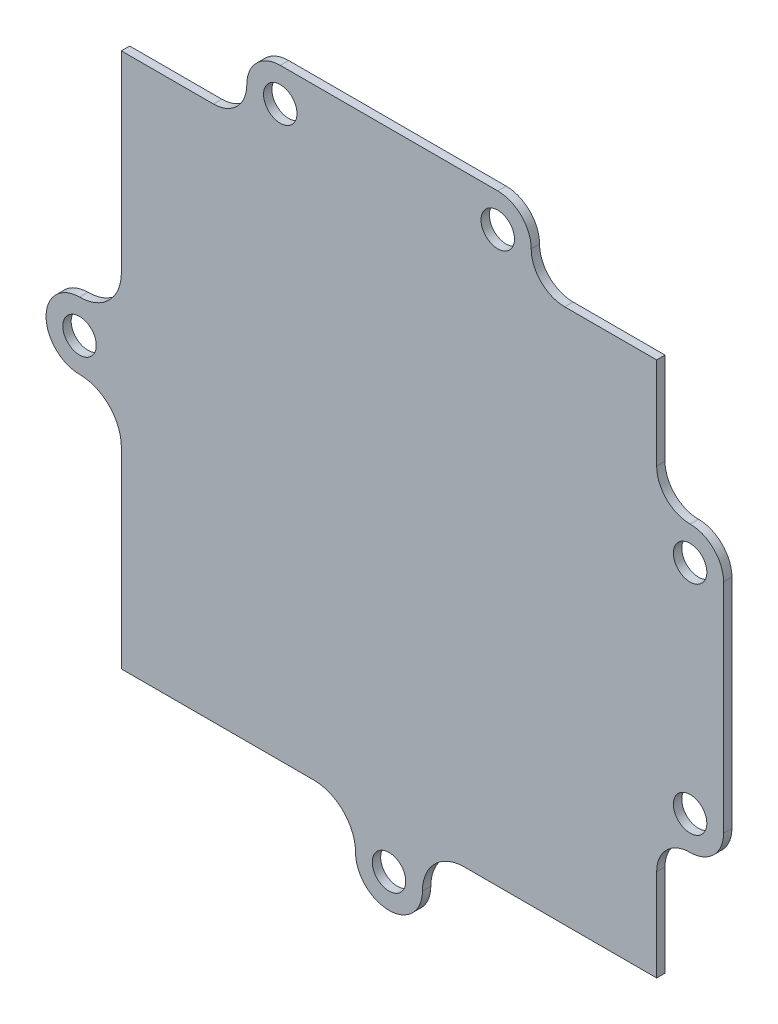
ISO-10303-21;
HEADER;
FILE_DESCRIPTION(('STEP AP214'),'2;1');
FILE_NAME('part.step','',(''),(''),'','','');
FILE_SCHEMA(('AUTOMOTIVE_DESIGN { 1 0 10303 214 1 1 1 1 }'));
ENDSEC;
DATA;
#1=APPLICATION_CONTEXT('core data for automotive mechanical design processes');
#2=APPLICATION_PROTOCOL_DEFINITION('international standard','automotive_design',2000,#1);
#3=PRODUCT_CONTEXT('',#1,'mechanical');
#4=PRODUCT('Part','Part','',(#3));
#5=PRODUCT_RELATED_PRODUCT_CATEGORY('part','',(#4));
#6=PRODUCT_DEFINITION_FORMATION('','',#4);
#7=PRODUCT_DEFINITION_CONTEXT('part definition',#1,'design');
#8=PRODUCT_DEFINITION('design','',#6,#7);
#9=PRODUCT_DEFINITION_SHAPE('','',#8);
#10=(LENGTH_UNIT() NAMED_UNIT(*) SI_UNIT(.MILLI.,.METRE.));
#11=(NAMED_UNIT(*) PLANE_ANGLE_UNIT() SI_UNIT($,.RADIAN.));
#12=(NAMED_UNIT(*) SI_UNIT($,.STERADIAN.) SOLID_ANGLE_UNIT());
#13=UNCERTAINTY_MEASURE_WITH_UNIT(LENGTH_MEASURE(1.E-05),#10,'distance_accuracy_value','');
#14=(GEOMETRIC_REPRESENTATION_CONTEXT(3) GLOBAL_UNCERTAINTY_ASSIGNED_CONTEXT((#13)) GLOBAL_UNIT_ASSIGNED_CONTEXT((#10,
#11,#12)) REPRESENTATION_CONTEXT('',''));
#15=CARTESIAN_POINT('',(0.,0.,0.));
#16=DIRECTION('',(0.,0.,1.));
#17=DIRECTION('',(1.,0.,0.));
#18=AXIS2_PLACEMENT_3D('',#15,#16,#17);
#19=CARTESIAN_POINT('',(36.0000000000001,-21.0000000000002,1.));
#20=DIRECTION('',(0.,0.,1.));
#21=DIRECTION('',(1.,0.,0.));
#22=AXIS2_PLACEMENT_3D('',#19,#20,#21);
#23=PLANE('',#22);
#24=CARTESIAN_POINT('',(36.0000000000001,13.0000000000001,1.));
#25=DIRECTION('',(0.,0.,1.));
#26=DIRECTION('',(1.,0.,0.));
#27=AXIS2_PLACEMENT_3D('',#24,#25,#26);
#28=CIRCLE('',#27,2.);
#29=CARTESIAN_POINT('',(38.0000000000001,13.0000000000001,1.));
#30=VERTEX_POINT('',#29);
#31=EDGE_CURVE('E455',#30,#30,#28,.T.);
#32=ORIENTED_EDGE('',*,*,#31,.F.);
#33=EDGE_LOOP('',(#32));
#34=FACE_BOUND('',#33,.T.);
#35=CARTESIAN_POINT('',(0.,-37.,1.));
#36=DIRECTION('',(0.,0.,1.));
#37=DIRECTION('',(1.,0.,0.));
#38=AXIS2_PLACEMENT_3D('',#35,#36,#37);
#39=CIRCLE('',#38,2.);
#40=CARTESIAN_POINT('',(2.00000000000001,-37.,1.));
#41=VERTEX_POINT('',#40);
#42=EDGE_CURVE('E467',#41,#41,#39,.T.);
#43=ORIENTED_EDGE('',*,*,#42,.F.);
#44=EDGE_LOOP('',(#43));
#45=FACE_BOUND('',#44,.T.);
#46=CARTESIAN_POINT('',(-37.,0.,1.));
#47=DIRECTION('',(0.,0.,1.));
#48=DIRECTION('',(1.,0.,0.));
#49=AXIS2_PLACEMENT_3D('',#46,#47,#48);
#50=CIRCLE('',#49,2.);
#51=CARTESIAN_POINT('',(-35.,0.,1.));
#52=VERTEX_POINT('',#51);
#53=EDGE_CURVE('E230',#52,#52,#50,.T.);
#54=ORIENTED_EDGE('',*,*,#53,.F.);
#55=EDGE_LOOP('',(#54));
#56=FACE_BOUND('',#55,.T.);
#57=CARTESIAN_POINT('',(36.0000000000001,-21.0000000000002,1.));
#58=DIRECTION('',(0.,0.,-1.));
#59=DIRECTION('',(1.,0.,0.));
#60=AXIS2_PLACEMENT_3D('',#57,#58,#59);
#61=CIRCLE('',#60,4.00000000000012);
#62=CARTESIAN_POINT('',(32.,-21.0000000000002,1.));
#63=VERTEX_POINT('',#62);
#64=CARTESIAN_POINT('',(36.0000000000001,-17.0000000000001,1.));
#65=VERTEX_POINT('',#64);
#66=EDGE_CURVE('E273',#63,#65,#61,.T.);
#67=ORIENTED_EDGE('',*,*,#66,.T.);
#68=CARTESIAN_POINT('',(36.0000000000001,-13.0000000000001,1.));
#69=DIRECTION('',(0.,0.,1.));
#70=DIRECTION('',(1.,0.,0.));
#71=AXIS2_PLACEMENT_3D('',#68,#69,#70);
#72=CIRCLE('',#71,3.99999999999997);
#73=CARTESIAN_POINT('',(40.0000000000001,-13.0000000000001,1.));
#74=VERTEX_POINT('',#73);
#75=EDGE_CURVE('E141',#65,#74,#72,.T.);
#76=ORIENTED_EDGE('',*,*,#75,.T.);
#77=DIRECTION('',(0.,1.,0.));
#78=VECTOR('',#77,1.);
#79=CARTESIAN_POINT('',(40.0000000000001,-13.0000000000001,1.));
#80=LINE('',#79,#78);
#81=CARTESIAN_POINT('',(40.0000000000001,13.0000000000001,1.));
#82=VERTEX_POINT('',#81);
#83=EDGE_CURVE('E336',#74,#82,#80,.T.);
#84=ORIENTED_EDGE('',*,*,#83,.T.);
#85=CARTESIAN_POINT('',(36.0000000000001,13.0000000000001,1.));
#86=DIRECTION('',(0.,0.,1.));
#87=DIRECTION('',(1.,0.,0.));
#88=AXIS2_PLACEMENT_3D('',#85,#86,#87);
#89=CIRCLE('',#88,3.99999999999998);
#90=CARTESIAN_POINT('',(36.0000000000001,17.0000000000001,1.));
#91=VERTEX_POINT('',#90);
#92=EDGE_CURVE('E355',#82,#91,#89,.T.);
#93=ORIENTED_EDGE('',*,*,#92,.T.);
#94=CARTESIAN_POINT('',(36.0000000000001,21.0000000000003,1.));
#95=DIRECTION('',(0.,0.,-1.));
#96=DIRECTION('',(1.,0.,0.));
#97=AXIS2_PLACEMENT_3D('',#94,#95,#96);
#98=CIRCLE('',#97,4.00000000000011);
#99=CARTESIAN_POINT('',(32.,21.0000000000003,1.));
#100=VERTEX_POINT('',#99);
#101=EDGE_CURVE('E352',#91,#100,#98,.T.);
#102=ORIENTED_EDGE('',*,*,#101,.T.);
#103=DIRECTION('',(0.,1.,0.));
#104=VECTOR('',#103,1.);
#105=CARTESIAN_POINT('',(32.,21.0000000000003,1.));
#106=LINE('',#105,#104);
#107=CARTESIAN_POINT('',(32.,32.,1.));
#108=VERTEX_POINT('',#107);
#109=EDGE_CURVE('E354',#100,#108,#106,.T.);
#110=ORIENTED_EDGE('',*,*,#109,.T.);
#111=DIRECTION('',(-1.,0.,0.));
#112=VECTOR('',#111,1.);
#113=CARTESIAN_POINT('',(32.,32.,1.));
#114=LINE('',#113,#112);
#115=CARTESIAN_POINT('',(21.0000000000002,32.,1.));
#116=VERTEX_POINT('',#115);
#117=EDGE_CURVE('E357',#108,#116,#114,.T.);
#118=ORIENTED_EDGE('',*,*,#117,.T.);
#119=CARTESIAN_POINT('',(21.0000000000002,36.0000000000001,1.));
#120=DIRECTION('',(0.,0.,-1.));
#121=DIRECTION('',(1.,0.,0.));
#122=AXIS2_PLACEMENT_3D('',#119,#120,#121);
#123=CIRCLE('',#122,4.00000000000011);
#124=CARTESIAN_POINT('',(17.0000000000001,36.0000000000001,1.));
#125=VERTEX_POINT('',#124);
#126=EDGE_CURVE('E363',#116,#125,#123,.T.);
#127=ORIENTED_EDGE('',*,*,#126,.T.);
#128=CARTESIAN_POINT('',(13.0000000000001,36.0000000000001,1.));
#129=DIRECTION('',(0.,0.,1.));
#130=DIRECTION('',(1.,0.,0.));
#131=AXIS2_PLACEMENT_3D('',#128,#129,#130);
#132=CIRCLE('',#131,4.);
#133=CARTESIAN_POINT('',(13.0000000000001,40.0000000000001,1.));
#134=VERTEX_POINT('',#133);
#135=EDGE_CURVE('E365',#125,#134,#132,.T.);
#136=ORIENTED_EDGE('',*,*,#135,.T.);
#137=DIRECTION('',(-1.,0.,0.));
#138=VECTOR('',#137,1.);
#139=CARTESIAN_POINT('',(13.0000000000001,40.0000000000001,1.));
#140=LINE('',#139,#138);
#141=CARTESIAN_POINT('',(-13.0000000000001,40.0000000000001,1.));
#142=VERTEX_POINT('',#141);
#143=EDGE_CURVE('E367',#134,#142,#140,.T.);
#144=ORIENTED_EDGE('',*,*,#143,.T.);
#145=CARTESIAN_POINT('',(-13.0000000000001,36.0000000000001,1.));
#146=DIRECTION('',(0.,0.,1.));
#147=DIRECTION('',(1.,0.,0.));
#148=AXIS2_PLACEMENT_3D('',#145,#146,#147);
#149=CIRCLE('',#148,3.99999999999997);
#150=CARTESIAN_POINT('',(-17.0000000000001,36.0000000000001,1.));
#151=VERTEX_POINT('',#150);
#152=EDGE_CURVE('E369',#142,#151,#149,.T.);
#153=ORIENTED_EDGE('',*,*,#152,.T.);
#154=CARTESIAN_POINT('',(-21.0000000000003,36.0000000000001,1.));
#155=DIRECTION('',(0.,0.,-1.));
#156=DIRECTION('',(1.,0.,0.));
#157=AXIS2_PLACEMENT_3D('',#154,#155,#156);
#158=CIRCLE('',#157,4.00000000000012);
#159=CARTESIAN_POINT('',(-21.0000000000003,32.,1.));
#160=VERTEX_POINT('',#159);
#161=EDGE_CURVE('E371',#151,#160,#158,.T.);
#162=ORIENTED_EDGE('',*,*,#161,.T.);
#163=DIRECTION('',(-1.,0.,0.));
#164=VECTOR('',#163,1.);
#165=CARTESIAN_POINT('',(-21.0000000000003,32.,1.));
#166=LINE('',#165,#164);
#167=CARTESIAN_POINT('',(-32.,32.,1.));
#168=VERTEX_POINT('',#167);
#169=EDGE_CURVE('E373',#160,#168,#166,.T.);
#170=ORIENTED_EDGE('',*,*,#169,.T.);
#171=DIRECTION('',(0.,-1.,0.));
#172=VECTOR('',#171,1.);
#173=CARTESIAN_POINT('',(-32.,32.,1.));
#174=LINE('',#173,#172);
#175=CARTESIAN_POINT('',(-32.,9.00000000000001,1.));
#176=VERTEX_POINT('',#175);
#177=EDGE_CURVE('E375',#168,#176,#174,.T.);
#178=ORIENTED_EDGE('',*,*,#177,.T.);
#179=CARTESIAN_POINT('',(-37.,9.00000000000001,1.));
#180=DIRECTION('',(0.,0.,-1.));
#181=DIRECTION('',(1.,0.,0.));
#182=AXIS2_PLACEMENT_3D('',#179,#180,#181);
#183=CIRCLE('',#182,5.);
#184=CARTESIAN_POINT('',(-37.,4.,1.));
#185=VERTEX_POINT('',#184);
#186=EDGE_CURVE('E377',#176,#185,#183,.T.);
#187=ORIENTED_EDGE('',*,*,#186,.T.);
#188=CARTESIAN_POINT('',(-37.,0.,1.));
#189=DIRECTION('',(0.,0.,1.));
#190=DIRECTION('',(1.,0.,0.));
#191=AXIS2_PLACEMENT_3D('',#188,#189,#190);
#192=CIRCLE('',#191,4.);
#193=CARTESIAN_POINT('',(-37.,-4.,1.));
#194=VERTEX_POINT('',#193);
#195=EDGE_CURVE('E379',#185,#194,#192,.T.);
#196=ORIENTED_EDGE('',*,*,#195,.T.);
#197=CARTESIAN_POINT('',(-37.,-9.00000000000001,1.));
#198=DIRECTION('',(0.,0.,-1.));
#199=DIRECTION('',(1.,0.,0.));
#200=AXIS2_PLACEMENT_3D('',#197,#198,#199);
#201=CIRCLE('',#200,5.);
#202=CARTESIAN_POINT('',(-32.,-9.00000000000001,1.));
#203=VERTEX_POINT('',#202);
#204=EDGE_CURVE('E381',#194,#203,#201,.T.);
#205=ORIENTED_EDGE('',*,*,#204,.T.);
#206=DIRECTION('',(0.,-1.,0.));
#207=VECTOR('',#206,1.);
#208=CARTESIAN_POINT('',(-32.,-9.00000000000001,1.));
#209=LINE('',#208,#207);
#210=CARTESIAN_POINT('',(-32.,-32.,1.));
#211=VERTEX_POINT('',#210);
#212=EDGE_CURVE('E383',#203,#211,#209,.T.);
#213=ORIENTED_EDGE('',*,*,#212,.T.);
#214=DIRECTION('',(1.,0.,0.));
#215=VECTOR('',#214,1.);
#216=CARTESIAN_POINT('',(-32.,-32.,1.));
#217=LINE('',#216,#215);
#218=CARTESIAN_POINT('',(-9.,-32.,1.));
#219=VERTEX_POINT('',#218);
#220=EDGE_CURVE('E385',#211,#219,#217,.T.);
#221=ORIENTED_EDGE('',*,*,#220,.T.);
#222=CARTESIAN_POINT('',(-9.,-37.,1.));
#223=DIRECTION('',(0.,0.,-1.));
#224=DIRECTION('',(1.,0.,0.));
#225=AXIS2_PLACEMENT_3D('',#222,#223,#224);
#226=CIRCLE('',#225,5.);
#227=CARTESIAN_POINT('',(-3.99999999999999,-37.,1.));
#228=VERTEX_POINT('',#227);
#229=EDGE_CURVE('E387',#219,#228,#226,.T.);
#230=ORIENTED_EDGE('',*,*,#229,.T.);
#231=CARTESIAN_POINT('',(0.,-37.,1.));
#232=DIRECTION('',(0.,0.,1.));
#233=DIRECTION('',(1.,0.,0.));
#234=AXIS2_PLACEMENT_3D('',#231,#232,#233);
#235=CIRCLE('',#234,4.);
#236=CARTESIAN_POINT('',(4.00000000000001,-37.,1.));
#237=VERTEX_POINT('',#236);
#238=EDGE_CURVE('E208',#228,#237,#235,.T.);
#239=ORIENTED_EDGE('',*,*,#238,.T.);
#240=CARTESIAN_POINT('',(9.00000000000001,-37.,1.));
#241=DIRECTION('',(0.,0.,-1.));
#242=DIRECTION('',(1.,0.,0.));
#243=AXIS2_PLACEMENT_3D('',#240,#241,#242);
#244=CIRCLE('',#243,5.);
#245=CARTESIAN_POINT('',(9.00000000000001,-32.,1.));
#246=VERTEX_POINT('',#245);
#247=EDGE_CURVE('E202',#237,#246,#244,.T.);
#248=ORIENTED_EDGE('',*,*,#247,.T.);
#249=DIRECTION('',(1.,0.,0.));
#250=VECTOR('',#249,1.);
#251=CARTESIAN_POINT('',(9.00000000000001,-32.,1.));
#252=LINE('',#251,#250);
#253=CARTESIAN_POINT('',(32.,-32.,1.));
#254=VERTEX_POINT('',#253);
#255=EDGE_CURVE('E206',#246,#254,#252,.T.);
#256=ORIENTED_EDGE('',*,*,#255,.T.);
#257=DIRECTION('',(0.,1.,0.));
#258=VECTOR('',#257,1.);
#259=CARTESIAN_POINT('',(32.,-32.,1.));
#260=LINE('',#259,#258);
#261=EDGE_CURVE('E50',#254,#63,#260,.T.);
#262=ORIENTED_EDGE('',*,*,#261,.T.);
#263=EDGE_LOOP('',(#67,#76,#84,#93,#102,#110,#118,#127,#136,#144,#153,#162,#170,#178,#187,#196,
#205,#213,#221,#230,#239,#248,#256,#262));
#264=FACE_BOUND('',#263,.T.);
#265=CARTESIAN_POINT('',(-13.0000000000001,36.0000000000001,1.));
#266=DIRECTION('',(0.,0.,1.));
#267=DIRECTION('',(1.,0.,0.));
#268=AXIS2_PLACEMENT_3D('',#265,#266,#267);
#269=CIRCLE('',#268,2.);
#270=CARTESIAN_POINT('',(-11.0000000000001,36.0000000000001,1.));
#271=VERTEX_POINT('',#270);
#272=EDGE_CURVE('E473',#271,#271,#269,.T.);
#273=ORIENTED_EDGE('',*,*,#272,.F.);
#274=EDGE_LOOP('',(#273));
#275=FACE_BOUND('',#274,.T.);
#276=CARTESIAN_POINT('',(36.0000000000001,-13.0000000000001,1.));
#277=DIRECTION('',(0.,0.,1.));
#278=DIRECTION('',(1.,0.,0.));
#279=AXIS2_PLACEMENT_3D('',#276,#277,#278);
#280=CIRCLE('',#279,2.);
#281=CARTESIAN_POINT('',(38.0000000000001,-13.0000000000001,1.));
#282=VERTEX_POINT('',#281);
#283=EDGE_CURVE('E461',#282,#282,#280,.T.);
#284=ORIENTED_EDGE('',*,*,#283,.F.);
#285=EDGE_LOOP('',(#284));
#286=FACE_BOUND('',#285,.T.);
#287=CARTESIAN_POINT('',(13.0000000000001,36.0000000000001,1.));
#288=DIRECTION('',(0.,0.,1.));
#289=DIRECTION('',(1.,0.,0.));
#290=AXIS2_PLACEMENT_3D('',#287,#288,#289);
#291=CIRCLE('',#290,2.);
#292=CARTESIAN_POINT('',(15.0000000000001,36.0000000000001,1.));
#293=VERTEX_POINT('',#292);
#294=EDGE_CURVE('E446',#293,#293,#291,.T.);
#295=ORIENTED_EDGE('',*,*,#294,.F.);
#296=EDGE_LOOP('',(#295));
#297=FACE_BOUND('',#296,.T.);
#298=ADVANCED_FACE('F33',(#34,#45,#56,#264,#275,#286,#297),#23,.T.);
#299=CARTESIAN_POINT('',(36.0000000000001,-21.0000000000002,0.));
#300=DIRECTION('',(0.,0.,1.));
#301=DIRECTION('',(1.,0.,0.));
#302=AXIS2_PLACEMENT_3D('',#299,#300,#301);
#303=PLANE('',#302);
#304=CARTESIAN_POINT('',(36.0000000000001,-21.0000000000002,0.));
#305=DIRECTION('',(0.,0.,-1.));
#306=DIRECTION('',(1.,0.,0.));
#307=AXIS2_PLACEMENT_3D('',#304,#305,#306);
#308=CIRCLE('',#307,4.00000000000012);
#309=CARTESIAN_POINT('',(32.,-21.0000000000002,0.));
#310=VERTEX_POINT('',#309);
#311=CARTESIAN_POINT('',(36.0000000000001,-17.0000000000001,0.));
#312=VERTEX_POINT('',#311);
#313=EDGE_CURVE('E226',#310,#312,#308,.T.);
#314=ORIENTED_EDGE('',*,*,#313,.F.);
#315=DIRECTION('',(0.,1.,0.));
#316=VECTOR('',#315,1.);
#317=CARTESIAN_POINT('',(32.,-32.,0.));
#318=LINE('',#317,#316);
#319=CARTESIAN_POINT('',(32.,-32.,0.));
#320=VERTEX_POINT('',#319);
#321=EDGE_CURVE('E133',#320,#310,#318,.T.);
#322=ORIENTED_EDGE('',*,*,#321,.F.);
#323=DIRECTION('',(1.,0.,0.));
#324=VECTOR('',#323,1.);
#325=CARTESIAN_POINT('',(9.00000000000001,-32.,0.));
#326=LINE('',#325,#324);
#327=CARTESIAN_POINT('',(9.00000000000001,-32.,0.));
#328=VERTEX_POINT('',#327);
#329=EDGE_CURVE('E127',#328,#320,#326,.T.);
#330=ORIENTED_EDGE('',*,*,#329,.F.);
#331=CARTESIAN_POINT('',(9.00000000000001,-37.,0.));
#332=DIRECTION('',(0.,0.,-1.));
#333=DIRECTION('',(1.,0.,0.));
#334=AXIS2_PLACEMENT_3D('',#331,#332,#333);
#335=CIRCLE('',#334,5.);
#336=CARTESIAN_POINT('',(4.00000000000001,-37.,0.));
#337=VERTEX_POINT('',#336);
#338=EDGE_CURVE('E216',#337,#328,#335,.T.);
#339=ORIENTED_EDGE('',*,*,#338,.F.);
#340=CARTESIAN_POINT('',(0.,-37.,0.));
#341=DIRECTION('',(0.,0.,1.));
#342=DIRECTION('',(1.,0.,0.));
#343=AXIS2_PLACEMENT_3D('',#340,#341,#342);
#344=CIRCLE('',#343,4.);
#345=CARTESIAN_POINT('',(-3.99999999999999,-37.,0.));
#346=VERTEX_POINT('',#345);
#347=EDGE_CURVE('E268',#346,#337,#344,.T.);
#348=ORIENTED_EDGE('',*,*,#347,.F.);
#349=CARTESIAN_POINT('',(-9.,-37.,0.));
#350=DIRECTION('',(0.,0.,-1.));
#351=DIRECTION('',(1.,0.,0.));
#352=AXIS2_PLACEMENT_3D('',#349,#350,#351);
#353=CIRCLE('',#352,5.);
#354=CARTESIAN_POINT('',(-9.,-32.,0.));
#355=VERTEX_POINT('',#354);
#356=EDGE_CURVE('E266',#355,#346,#353,.T.);
#357=ORIENTED_EDGE('',*,*,#356,.F.);
#358=DIRECTION('',(1.,0.,0.));
#359=VECTOR('',#358,1.);
#360=CARTESIAN_POINT('',(-32.,-32.,0.));
#361=LINE('',#360,#359);
#362=CARTESIAN_POINT('',(-32.,-32.,0.));
#363=VERTEX_POINT('',#362);
#364=EDGE_CURVE('E264',#363,#355,#361,.T.);
#365=ORIENTED_EDGE('',*,*,#364,.F.);
#366=DIRECTION('',(0.,-1.,0.));
#367=VECTOR('',#366,1.);
#368=CARTESIAN_POINT('',(-32.,-9.00000000000001,0.));
#369=LINE('',#368,#367);
#370=CARTESIAN_POINT('',(-32.,-9.00000000000001,0.));
#371=VERTEX_POINT('',#370);
#372=EDGE_CURVE('E262',#371,#363,#369,.T.);
#373=ORIENTED_EDGE('',*,*,#372,.F.);
#374=CARTESIAN_POINT('',(-37.,-9.00000000000001,0.));
#375=DIRECTION('',(0.,0.,-1.));
#376=DIRECTION('',(1.,0.,0.));
#377=AXIS2_PLACEMENT_3D('',#374,#375,#376);
#378=CIRCLE('',#377,5.);
#379=CARTESIAN_POINT('',(-37.,-4.,0.));
#380=VERTEX_POINT('',#379);
#381=EDGE_CURVE('E260',#380,#371,#378,.T.);
#382=ORIENTED_EDGE('',*,*,#381,.F.);
#383=CARTESIAN_POINT('',(-37.,0.,0.));
#384=DIRECTION('',(0.,0.,1.));
#385=DIRECTION('',(1.,0.,0.));
#386=AXIS2_PLACEMENT_3D('',#383,#384,#385);
#387=CIRCLE('',#386,4.);
#388=CARTESIAN_POINT('',(-37.,4.,0.));
#389=VERTEX_POINT('',#388);
#390=EDGE_CURVE('E258',#389,#380,#387,.T.);
#391=ORIENTED_EDGE('',*,*,#390,.F.);
#392=CARTESIAN_POINT('',(-37.,9.00000000000001,0.));
#393=DIRECTION('',(0.,0.,-1.));
#394=DIRECTION('',(1.,0.,0.));
#395=AXIS2_PLACEMENT_3D('',#392,#393,#394);
#396=CIRCLE('',#395,5.);
#397=CARTESIAN_POINT('',(-32.,9.00000000000001,0.));
#398=VERTEX_POINT('',#397);
#399=EDGE_CURVE('E256',#398,#389,#396,.T.);
#400=ORIENTED_EDGE('',*,*,#399,.F.);
#401=DIRECTION('',(0.,-1.,0.));
#402=VECTOR('',#401,1.);
#403=CARTESIAN_POINT('',(-32.,32.,0.));
#404=LINE('',#403,#402);
#405=CARTESIAN_POINT('',(-32.,32.,0.));
#406=VERTEX_POINT('',#405);
#407=EDGE_CURVE('E254',#406,#398,#404,.T.);
#408=ORIENTED_EDGE('',*,*,#407,.F.);
#409=DIRECTION('',(-1.,0.,0.));
#410=VECTOR('',#409,1.);
#411=CARTESIAN_POINT('',(-21.0000000000003,32.,0.));
#412=LINE('',#411,#410);
#413=CARTESIAN_POINT('',(-21.0000000000003,32.,0.));
#414=VERTEX_POINT('',#413);
#415=EDGE_CURVE('E252',#414,#406,#412,.T.);
#416=ORIENTED_EDGE('',*,*,#415,.F.);
#417=CARTESIAN_POINT('',(-21.0000000000003,36.0000000000001,0.));
#418=DIRECTION('',(0.,0.,-1.));
#419=DIRECTION('',(1.,0.,0.));
#420=AXIS2_PLACEMENT_3D('',#417,#418,#419);
#421=CIRCLE('',#420,4.00000000000012);
#422=CARTESIAN_POINT('',(-17.0000000000001,36.0000000000001,0.));
#423=VERTEX_POINT('',#422);
#424=EDGE_CURVE('E250',#423,#414,#421,.T.);
#425=ORIENTED_EDGE('',*,*,#424,.F.);
#426=CARTESIAN_POINT('',(-13.0000000000001,36.0000000000001,0.));
#427=DIRECTION('',(0.,0.,1.));
#428=DIRECTION('',(1.,0.,0.));
#429=AXIS2_PLACEMENT_3D('',#426,#427,#428);
#430=CIRCLE('',#429,3.99999999999997);
#431=CARTESIAN_POINT('',(-13.0000000000001,40.0000000000001,0.));
#432=VERTEX_POINT('',#431);
#433=EDGE_CURVE('E248',#432,#423,#430,.T.);
#434=ORIENTED_EDGE('',*,*,#433,.F.);
#435=DIRECTION('',(-1.,0.,0.));
#436=VECTOR('',#435,1.);
#437=CARTESIAN_POINT('',(13.0000000000001,40.0000000000001,0.));
#438=LINE('',#437,#436);
#439=CARTESIAN_POINT('',(13.0000000000001,40.0000000000001,0.));
#440=VERTEX_POINT('',#439);
#441=EDGE_CURVE('E246',#440,#432,#438,.T.);
#442=ORIENTED_EDGE('',*,*,#441,.F.);
#443=CARTESIAN_POINT('',(13.0000000000001,36.0000000000001,0.));
#444=DIRECTION('',(0.,0.,1.));
#445=DIRECTION('',(1.,0.,0.));
#446=AXIS2_PLACEMENT_3D('',#443,#444,#445);
#447=CIRCLE('',#446,4.);
#448=CARTESIAN_POINT('',(17.0000000000001,36.0000000000001,0.));
#449=VERTEX_POINT('',#448);
#450=EDGE_CURVE('E244',#449,#440,#447,.T.);
#451=ORIENTED_EDGE('',*,*,#450,.F.);
#452=CARTESIAN_POINT('',(21.0000000000002,36.0000000000001,0.));
#453=DIRECTION('',(0.,0.,-1.));
#454=DIRECTION('',(1.,0.,0.));
#455=AXIS2_PLACEMENT_3D('',#452,#453,#454);
#456=CIRCLE('',#455,4.00000000000011);
#457=CARTESIAN_POINT('',(21.0000000000002,32.,0.));
#458=VERTEX_POINT('',#457);
#459=EDGE_CURVE('E242',#458,#449,#456,.T.);
#460=ORIENTED_EDGE('',*,*,#459,.F.);
#461=DIRECTION('',(-1.,0.,0.));
#462=VECTOR('',#461,1.);
#463=CARTESIAN_POINT('',(32.,32.,0.));
#464=LINE('',#463,#462);
#465=CARTESIAN_POINT('',(32.,32.,0.));
#466=VERTEX_POINT('',#465);
#467=EDGE_CURVE('E240',#466,#458,#464,.T.);
#468=ORIENTED_EDGE('',*,*,#467,.F.);
#469=DIRECTION('',(0.,1.,0.));
#470=VECTOR('',#469,1.);
#471=CARTESIAN_POINT('',(32.,21.0000000000003,0.));
#472=LINE('',#471,#470);
#473=CARTESIAN_POINT('',(32.,21.0000000000003,0.));
#474=VERTEX_POINT('',#473);
#475=EDGE_CURVE('E238',#474,#466,#472,.T.);
#476=ORIENTED_EDGE('',*,*,#475,.F.);
#477=CARTESIAN_POINT('',(36.0000000000001,21.0000000000003,0.));
#478=DIRECTION('',(0.,0.,-1.));
#479=DIRECTION('',(1.,0.,0.));
#480=AXIS2_PLACEMENT_3D('',#477,#478,#479);
#481=CIRCLE('',#480,4.00000000000011);
#482=CARTESIAN_POINT('',(36.0000000000001,17.0000000000001,0.));
#483=VERTEX_POINT('',#482);
#484=EDGE_CURVE('E236',#483,#474,#481,.T.);
#485=ORIENTED_EDGE('',*,*,#484,.F.);
#486=CARTESIAN_POINT('',(36.0000000000001,13.0000000000001,0.));
#487=DIRECTION('',(0.,0.,1.));
#488=DIRECTION('',(1.,0.,0.));
#489=AXIS2_PLACEMENT_3D('',#486,#487,#488);
#490=CIRCLE('',#489,3.99999999999998);
#491=CARTESIAN_POINT('',(40.0000000000001,13.0000000000001,0.));
#492=VERTEX_POINT('',#491);
#493=EDGE_CURVE('E234',#492,#483,#490,.T.);
#494=ORIENTED_EDGE('',*,*,#493,.F.);
#495=DIRECTION('',(0.,1.,0.));
#496=VECTOR('',#495,1.);
#497=CARTESIAN_POINT('',(40.0000000000001,-13.0000000000001,0.));
#498=LINE('',#497,#496);
#499=CARTESIAN_POINT('',(40.0000000000001,-13.0000000000001,0.));
#500=VERTEX_POINT('',#499);
#501=EDGE_CURVE('E232',#500,#492,#498,.T.);
#502=ORIENTED_EDGE('',*,*,#501,.F.);
#503=CARTESIAN_POINT('',(36.0000000000001,-13.0000000000001,0.));
#504=DIRECTION('',(0.,0.,1.));
#505=DIRECTION('',(1.,0.,0.));
#506=AXIS2_PLACEMENT_3D('',#503,#504,#505);
#507=CIRCLE('',#506,3.99999999999997);
#508=EDGE_CURVE('E229',#312,#500,#507,.T.);
#509=ORIENTED_EDGE('',*,*,#508,.F.);
#510=EDGE_LOOP('',(#314,#322,#330,#339,#348,#357,#365,#373,#382,#391,#400,#408,#416,#425,#434,
#442,#451,#460,#468,#476,#485,#494,#502,#509));
#511=FACE_BOUND('',#510,.T.);
#512=CARTESIAN_POINT('',(-37.,0.,0.));
#513=DIRECTION('',(0.,0.,1.));
#514=DIRECTION('',(1.,0.,0.));
#515=AXIS2_PLACEMENT_3D('',#512,#513,#514);
#516=CIRCLE('',#515,2.);
#517=CARTESIAN_POINT('',(-35.,0.,0.));
#518=VERTEX_POINT('',#517);
#519=EDGE_CURVE('E476',#518,#518,#516,.T.);
#520=ORIENTED_EDGE('',*,*,#519,.T.);
#521=EDGE_LOOP('',(#520));
#522=FACE_BOUND('',#521,.T.);
#523=CARTESIAN_POINT('',(-13.0000000000001,36.0000000000001,0.));
#524=DIRECTION('',(0.,0.,1.));
#525=DIRECTION('',(1.,0.,0.));
#526=AXIS2_PLACEMENT_3D('',#523,#524,#525);
#527=CIRCLE('',#526,2.);
#528=CARTESIAN_POINT('',(-11.0000000000001,36.0000000000001,0.));
#529=VERTEX_POINT('',#528);
#530=EDGE_CURVE('E470',#529,#529,#527,.T.);
#531=ORIENTED_EDGE('',*,*,#530,.T.);
#532=EDGE_LOOP('',(#531));
#533=FACE_BOUND('',#532,.T.);
#534=CARTESIAN_POINT('',(0.,-37.,0.));
#535=DIRECTION('',(0.,0.,1.));
#536=DIRECTION('',(1.,0.,0.));
#537=AXIS2_PLACEMENT_3D('',#534,#535,#536);
#538=CIRCLE('',#537,2.);
#539=CARTESIAN_POINT('',(2.00000000000001,-37.,0.));
#540=VERTEX_POINT('',#539);
#541=EDGE_CURVE('E464',#540,#540,#538,.T.);
#542=ORIENTED_EDGE('',*,*,#541,.T.);
#543=EDGE_LOOP('',(#542));
#544=FACE_BOUND('',#543,.T.);
#545=CARTESIAN_POINT('',(36.0000000000001,-13.0000000000001,0.));
#546=DIRECTION('',(0.,0.,1.));
#547=DIRECTION('',(1.,0.,0.));
#548=AXIS2_PLACEMENT_3D('',#545,#546,#547);
#549=CIRCLE('',#548,2.);
#550=CARTESIAN_POINT('',(38.0000000000001,-13.0000000000001,0.));
#551=VERTEX_POINT('',#550);
#552=EDGE_CURVE('E458',#551,#551,#549,.T.);
#553=ORIENTED_EDGE('',*,*,#552,.T.);
#554=EDGE_LOOP('',(#553));
#555=FACE_BOUND('',#554,.T.);
#556=CARTESIAN_POINT('',(36.0000000000001,13.0000000000001,0.));
#557=DIRECTION('',(0.,0.,1.));
#558=DIRECTION('',(1.,0.,0.));
#559=AXIS2_PLACEMENT_3D('',#556,#557,#558);
#560=CIRCLE('',#559,2.);
#561=CARTESIAN_POINT('',(38.0000000000001,13.0000000000001,0.));
#562=VERTEX_POINT('',#561);
#563=EDGE_CURVE('E452',#562,#562,#560,.T.);
#564=ORIENTED_EDGE('',*,*,#563,.T.);
#565=EDGE_LOOP('',(#564));
#566=FACE_BOUND('',#565,.T.);
#567=CARTESIAN_POINT('',(13.0000000000001,36.0000000000001,0.));
#568=DIRECTION('',(0.,0.,1.));
#569=DIRECTION('',(1.,0.,0.));
#570=AXIS2_PLACEMENT_3D('',#567,#568,#569);
#571=CIRCLE('',#570,2.);
#572=CARTESIAN_POINT('',(15.0000000000001,36.0000000000001,0.));
#573=VERTEX_POINT('',#572);
#574=EDGE_CURVE('E449',#573,#573,#571,.T.);
#575=ORIENTED_EDGE('',*,*,#574,.T.);
#576=EDGE_LOOP('',(#575));
#577=FACE_BOUND('',#576,.T.);
#578=ADVANCED_FACE('F340',(#511,#522,#533,#544,#555,#566,#577),#303,.F.);
#579=CARTESIAN_POINT('',(36.0000000000001,-21.0000000000002,1.));
#580=DIRECTION('',(0.,0.,-1.));
#581=DIRECTION('',(-1.,0.,0.));
#582=AXIS2_PLACEMENT_3D('',#579,#580,#581);
#583=CYLINDRICAL_SURFACE('',#582,4.00000000000012);
#584=ORIENTED_EDGE('',*,*,#313,.T.);
#585=DIRECTION('',(0.,0.,-1.));
#586=VECTOR('',#585,1.);
#587=CARTESIAN_POINT('',(36.0000000000001,-17.0000000000001,1.));
#588=LINE('',#587,#586);
#589=EDGE_CURVE('E11',#65,#312,#588,.T.);
#590=ORIENTED_EDGE('',*,*,#589,.F.);
#591=ORIENTED_EDGE('',*,*,#66,.F.);
#592=DIRECTION('',(0.,0.,-1.));
#593=VECTOR('',#592,1.);
#594=CARTESIAN_POINT('',(32.,-21.0000000000002,1.));
#595=LINE('',#594,#593);
#596=EDGE_CURVE('E222',#63,#310,#595,.T.);
#597=ORIENTED_EDGE('',*,*,#596,.T.);
#598=EDGE_LOOP('',(#584,#590,#591,#597));
#599=FACE_BOUND('',#598,.T.);
#600=ADVANCED_FACE('F35',(#599),#583,.F.);
#601=CARTESIAN_POINT('',(36.0000000000001,-13.0000000000001,1.));
#602=DIRECTION('',(0.,0.,-1.));
#603=DIRECTION('',(-1.,0.,0.));
#604=AXIS2_PLACEMENT_3D('',#601,#602,#603);
#605=CYLINDRICAL_SURFACE('',#604,3.99999999999997);
#606=ORIENTED_EDGE('',*,*,#508,.T.);
#607=DIRECTION('',(0.,0.,-1.));
#608=VECTOR('',#607,1.);
#609=CARTESIAN_POINT('',(40.0000000000001,-13.0000000000001,1.));
#610=LINE('',#609,#608);
#611=EDGE_CURVE('E42',#74,#500,#610,.T.);
#612=ORIENTED_EDGE('',*,*,#611,.F.);
#613=ORIENTED_EDGE('',*,*,#75,.F.);
#614=ORIENTED_EDGE('',*,*,#589,.T.);
#615=EDGE_LOOP('',(#606,#612,#613,#614));
#616=FACE_BOUND('',#615,.T.);
#617=ADVANCED_FACE('F724',(#616),#605,.T.);
#618=CARTESIAN_POINT('',(40.0000000000001,-13.0000000000001,1.));
#619=DIRECTION('',(-1.,0.,0.));
#620=DIRECTION('',(0.,-1.,0.));
#621=AXIS2_PLACEMENT_3D('',#618,#619,#620);
#622=PLANE('',#621);
#623=ORIENTED_EDGE('',*,*,#501,.T.);
#624=DIRECTION('',(0.,0.,-1.));
#625=VECTOR('',#624,1.);
#626=CARTESIAN_POINT('',(40.0000000000001,13.0000000000001,1.));
#627=LINE('',#626,#625);
#628=EDGE_CURVE('E328',#82,#492,#627,.T.);
#629=ORIENTED_EDGE('',*,*,#628,.F.);
#630=ORIENTED_EDGE('',*,*,#83,.F.);
#631=ORIENTED_EDGE('',*,*,#611,.T.);
#632=EDGE_LOOP('',(#623,#629,#630,#631));
#633=FACE_BOUND('',#632,.T.);
#634=ADVANCED_FACE('F334',(#633),#622,.F.);
#635=CARTESIAN_POINT('',(36.0000000000001,13.0000000000001,1.));
#636=DIRECTION('',(0.,0.,-1.));
#637=DIRECTION('',(-1.,0.,0.));
#638=AXIS2_PLACEMENT_3D('',#635,#636,#637);
#639=CYLINDRICAL_SURFACE('',#638,3.99999999999998);
#640=ORIENTED_EDGE('',*,*,#493,.T.);
#641=DIRECTION('',(0.,0.,-1.));
#642=VECTOR('',#641,1.);
#643=CARTESIAN_POINT('',(36.0000000000001,17.0000000000001,1.));
#644=LINE('',#643,#642);
#645=EDGE_CURVE('E325',#91,#483,#644,.T.);
#646=ORIENTED_EDGE('',*,*,#645,.F.);
#647=ORIENTED_EDGE('',*,*,#92,.F.);
#648=ORIENTED_EDGE('',*,*,#628,.T.);
#649=EDGE_LOOP('',(#640,#646,#647,#648));
#650=FACE_BOUND('',#649,.T.);
#651=ADVANCED_FACE('F346',(#650),#639,.T.);
#652=CARTESIAN_POINT('',(36.0000000000001,21.0000000000003,1.));
#653=DIRECTION('',(0.,0.,-1.));
#654=DIRECTION('',(-1.,0.,0.));
#655=AXIS2_PLACEMENT_3D('',#652,#653,#654);
#656=CYLINDRICAL_SURFACE('',#655,4.00000000000011);
#657=ORIENTED_EDGE('',*,*,#484,.T.);
#658=DIRECTION('',(0.,0.,-1.));
#659=VECTOR('',#658,1.);
#660=CARTESIAN_POINT('',(32.,21.0000000000003,1.));
#661=LINE('',#660,#659);
#662=EDGE_CURVE('E322',#100,#474,#661,.T.);
#663=ORIENTED_EDGE('',*,*,#662,.F.);
#664=ORIENTED_EDGE('',*,*,#101,.F.);
#665=ORIENTED_EDGE('',*,*,#645,.T.);
#666=EDGE_LOOP('',(#657,#663,#664,#665));
#667=FACE_BOUND('',#666,.T.);
#668=ADVANCED_FACE('F350',(#667),#656,.F.);
#669=CARTESIAN_POINT('',(32.,21.0000000000003,1.));
#670=DIRECTION('',(-1.,0.,0.));
#671=DIRECTION('',(0.,-1.,0.));
#672=AXIS2_PLACEMENT_3D('',#669,#670,#671);
#673=PLANE('',#672);
#674=ORIENTED_EDGE('',*,*,#475,.T.);
#675=DIRECTION('',(0.,0.,-1.));
#676=VECTOR('',#675,1.);
#677=CARTESIAN_POINT('',(32.,32.,1.));
#678=LINE('',#677,#676);
#679=EDGE_CURVE('E319',#108,#466,#678,.T.);
#680=ORIENTED_EDGE('',*,*,#679,.F.);
#681=ORIENTED_EDGE('',*,*,#109,.F.);
#682=ORIENTED_EDGE('',*,*,#662,.T.);
#683=EDGE_LOOP('',(#674,#680,#681,#682));
#684=FACE_BOUND('',#683,.T.);
#685=ADVANCED_FACE('F689',(#684),#673,.F.);
#686=CARTESIAN_POINT('',(32.,32.,1.));
#687=DIRECTION('',(0.,-1.,0.));
#688=DIRECTION('',(0.,0.,-1.));
#689=AXIS2_PLACEMENT_3D('',#686,#687,#688);
#690=PLANE('',#689);
#691=ORIENTED_EDGE('',*,*,#467,.T.);
#692=DIRECTION('',(0.,0.,-1.));
#693=VECTOR('',#692,1.);
#694=CARTESIAN_POINT('',(21.0000000000002,32.,1.));
#695=LINE('',#694,#693);
#696=EDGE_CURVE('E316',#116,#458,#695,.T.);
#697=ORIENTED_EDGE('',*,*,#696,.F.);
#698=ORIENTED_EDGE('',*,*,#117,.F.);
#699=ORIENTED_EDGE('',*,*,#679,.T.);
#700=EDGE_LOOP('',(#691,#697,#698,#699));
#701=FACE_BOUND('',#700,.T.);
#702=ADVANCED_FACE('F679',(#701),#690,.F.);
#703=CARTESIAN_POINT('',(21.0000000000002,36.0000000000001,1.));
#704=DIRECTION('',(0.,0.,-1.));
#705=DIRECTION('',(-1.,0.,0.));
#706=AXIS2_PLACEMENT_3D('',#703,#704,#705);
#707=CYLINDRICAL_SURFACE('',#706,4.00000000000011);
#708=ORIENTED_EDGE('',*,*,#459,.T.);
#709=DIRECTION('',(0.,0.,-1.));
#710=VECTOR('',#709,1.);
#711=CARTESIAN_POINT('',(17.0000000000001,36.0000000000001,1.));
#712=LINE('',#711,#710);
#713=EDGE_CURVE('E313',#125,#449,#712,.T.);
#714=ORIENTED_EDGE('',*,*,#713,.F.);
#715=ORIENTED_EDGE('',*,*,#126,.F.);
#716=ORIENTED_EDGE('',*,*,#696,.T.);
#717=EDGE_LOOP('',(#708,#714,#715,#716));
#718=FACE_BOUND('',#717,.T.);
#719=ADVANCED_FACE('F669',(#718),#707,.F.);
#720=CARTESIAN_POINT('',(13.0000000000001,36.0000000000001,1.));
#721=DIRECTION('',(0.,0.,-1.));
#722=DIRECTION('',(-1.,0.,0.));
#723=AXIS2_PLACEMENT_3D('',#720,#721,#722);
#724=CYLINDRICAL_SURFACE('',#723,4.);
#725=ORIENTED_EDGE('',*,*,#450,.T.);
#726=DIRECTION('',(0.,0.,-1.));
#727=VECTOR('',#726,1.);
#728=CARTESIAN_POINT('',(13.0000000000001,40.0000000000001,1.));
#729=LINE('',#728,#727);
#730=EDGE_CURVE('E310',#134,#440,#729,.T.);
#731=ORIENTED_EDGE('',*,*,#730,.F.);
#732=ORIENTED_EDGE('',*,*,#135,.F.);
#733=ORIENTED_EDGE('',*,*,#713,.T.);
#734=EDGE_LOOP('',(#725,#731,#732,#733));
#735=FACE_BOUND('',#734,.T.);
#736=ADVANCED_FACE('F659',(#735),#724,.T.);
#737=CARTESIAN_POINT('',(13.0000000000001,40.0000000000001,1.));
#738=DIRECTION('',(0.,-1.,0.));
#739=DIRECTION('',(1.,0.,0.));
#740=AXIS2_PLACEMENT_3D('',#737,#738,#739);
#741=PLANE('',#740);
#742=ORIENTED_EDGE('',*,*,#441,.T.);
#743=DIRECTION('',(0.,0.,-1.));
#744=VECTOR('',#743,1.);
#745=CARTESIAN_POINT('',(-13.0000000000001,40.0000000000001,1.));
#746=LINE('',#745,#744);
#747=EDGE_CURVE('E307',#142,#432,#746,.T.);
#748=ORIENTED_EDGE('',*,*,#747,.F.);
#749=ORIENTED_EDGE('',*,*,#143,.F.);
#750=ORIENTED_EDGE('',*,*,#730,.T.);
#751=EDGE_LOOP('',(#742,#748,#749,#750));
#752=FACE_BOUND('',#751,.T.);
#753=ADVANCED_FACE('F649',(#752),#741,.F.);
#754=CARTESIAN_POINT('',(-13.0000000000001,36.0000000000001,1.));
#755=DIRECTION('',(0.,0.,-1.));
#756=DIRECTION('',(-1.,0.,0.));
#757=AXIS2_PLACEMENT_3D('',#754,#755,#756);
#758=CYLINDRICAL_SURFACE('',#757,3.99999999999997);
#759=ORIENTED_EDGE('',*,*,#433,.T.);
#760=DIRECTION('',(0.,0.,-1.));
#761=VECTOR('',#760,1.);
#762=CARTESIAN_POINT('',(-17.0000000000001,36.0000000000001,1.));
#763=LINE('',#762,#761);
#764=EDGE_CURVE('E304',#151,#423,#763,.T.);
#765=ORIENTED_EDGE('',*,*,#764,.F.);
#766=ORIENTED_EDGE('',*,*,#152,.F.);
#767=ORIENTED_EDGE('',*,*,#747,.T.);
#768=EDGE_LOOP('',(#759,#765,#766,#767));
#769=FACE_BOUND('',#768,.T.);
#770=ADVANCED_FACE('F639',(#769),#758,.T.);
#771=CARTESIAN_POINT('',(-21.0000000000003,36.0000000000001,1.));
#772=DIRECTION('',(0.,0.,-1.));
#773=DIRECTION('',(-1.,0.,0.));
#774=AXIS2_PLACEMENT_3D('',#771,#772,#773);
#775=CYLINDRICAL_SURFACE('',#774,4.00000000000012);
#776=ORIENTED_EDGE('',*,*,#424,.T.);
#777=DIRECTION('',(0.,0.,-1.));
#778=VECTOR('',#777,1.);
#779=CARTESIAN_POINT('',(-21.0000000000003,32.,1.));
#780=LINE('',#779,#778);
#781=EDGE_CURVE('E301',#160,#414,#780,.T.);
#782=ORIENTED_EDGE('',*,*,#781,.F.);
#783=ORIENTED_EDGE('',*,*,#161,.F.);
#784=ORIENTED_EDGE('',*,*,#764,.T.);
#785=EDGE_LOOP('',(#776,#782,#783,#784));
#786=FACE_BOUND('',#785,.T.);
#787=ADVANCED_FACE('F629',(#786),#775,.F.);
#788=CARTESIAN_POINT('',(-21.0000000000003,32.,1.));
#789=DIRECTION('',(0.,-1.,0.));
#790=DIRECTION('',(0.,0.,-1.));
#791=AXIS2_PLACEMENT_3D('',#788,#789,#790);
#792=PLANE('',#791);
#793=ORIENTED_EDGE('',*,*,#415,.T.);
#794=DIRECTION('',(0.,0.,-1.));
#795=VECTOR('',#794,1.);
#796=CARTESIAN_POINT('',(-32.,32.,1.));
#797=LINE('',#796,#795);
#798=EDGE_CURVE('E298',#168,#406,#797,.T.);
#799=ORIENTED_EDGE('',*,*,#798,.F.);
#800=ORIENTED_EDGE('',*,*,#169,.F.);
#801=ORIENTED_EDGE('',*,*,#781,.T.);
#802=EDGE_LOOP('',(#793,#799,#800,#801));
#803=FACE_BOUND('',#802,.T.);
#804=ADVANCED_FACE('F619',(#803),#792,.F.);
#805=CARTESIAN_POINT('',(-32.,32.,1.));
#806=DIRECTION('',(1.,0.,0.));
#807=DIRECTION('',(0.,0.,-1.));
#808=AXIS2_PLACEMENT_3D('',#805,#806,#807);
#809=PLANE('',#808);
#810=ORIENTED_EDGE('',*,*,#407,.T.);
#811=DIRECTION('',(0.,0.,-1.));
#812=VECTOR('',#811,1.);
#813=CARTESIAN_POINT('',(-32.,9.00000000000001,1.));
#814=LINE('',#813,#812);
#815=EDGE_CURVE('E295',#176,#398,#814,.T.);
#816=ORIENTED_EDGE('',*,*,#815,.F.);
#817=ORIENTED_EDGE('',*,*,#177,.F.);
#818=ORIENTED_EDGE('',*,*,#798,.T.);
#819=EDGE_LOOP('',(#810,#816,#817,#818));
#820=FACE_BOUND('',#819,.T.);
#821=ADVANCED_FACE('F609',(#820),#809,.F.);
#822=CARTESIAN_POINT('',(-37.,9.00000000000001,1.));
#823=DIRECTION('',(0.,0.,-1.));
#824=DIRECTION('',(-1.,0.,0.));
#825=AXIS2_PLACEMENT_3D('',#822,#823,#824);
#826=CYLINDRICAL_SURFACE('',#825,5.);
#827=ORIENTED_EDGE('',*,*,#399,.T.);
#828=DIRECTION('',(0.,0.,-1.));
#829=VECTOR('',#828,1.);
#830=CARTESIAN_POINT('',(-37.,4.,1.));
#831=LINE('',#830,#829);
#832=EDGE_CURVE('E292',#185,#389,#831,.T.);
#833=ORIENTED_EDGE('',*,*,#832,.F.);
#834=ORIENTED_EDGE('',*,*,#186,.F.);
#835=ORIENTED_EDGE('',*,*,#815,.T.);
#836=EDGE_LOOP('',(#827,#833,#834,#835));
#837=FACE_BOUND('',#836,.T.);
#838=ADVANCED_FACE('F599',(#837),#826,.F.);
#839=CARTESIAN_POINT('',(-37.,0.,1.));
#840=DIRECTION('',(0.,0.,-1.));
#841=DIRECTION('',(-1.,0.,0.));
#842=AXIS2_PLACEMENT_3D('',#839,#840,#841);
#843=CYLINDRICAL_SURFACE('',#842,4.);
#844=ORIENTED_EDGE('',*,*,#390,.T.);
#845=DIRECTION('',(0.,0.,-1.));
#846=VECTOR('',#845,1.);
#847=CARTESIAN_POINT('',(-37.,-4.,1.));
#848=LINE('',#847,#846);
#849=EDGE_CURVE('E289',#194,#380,#848,.T.);
#850=ORIENTED_EDGE('',*,*,#849,.F.);
#851=ORIENTED_EDGE('',*,*,#195,.F.);
#852=ORIENTED_EDGE('',*,*,#832,.T.);
#853=EDGE_LOOP('',(#844,#850,#851,#852));
#854=FACE_BOUND('',#853,.T.);
#855=ADVANCED_FACE('F589',(#854),#843,.T.);
#856=CARTESIAN_POINT('',(-37.,-9.00000000000001,1.));
#857=DIRECTION('',(0.,0.,-1.));
#858=DIRECTION('',(-1.,0.,0.));
#859=AXIS2_PLACEMENT_3D('',#856,#857,#858);
#860=CYLINDRICAL_SURFACE('',#859,5.);
#861=ORIENTED_EDGE('',*,*,#381,.T.);
#862=DIRECTION('',(0.,0.,-1.));
#863=VECTOR('',#862,1.);
#864=CARTESIAN_POINT('',(-32.,-9.00000000000001,1.));
#865=LINE('',#864,#863);
#866=EDGE_CURVE('E286',#203,#371,#865,.T.);
#867=ORIENTED_EDGE('',*,*,#866,.F.);
#868=ORIENTED_EDGE('',*,*,#204,.F.);
#869=ORIENTED_EDGE('',*,*,#849,.T.);
#870=EDGE_LOOP('',(#861,#867,#868,#869));
#871=FACE_BOUND('',#870,.T.);
#872=ADVANCED_FACE('F579',(#871),#860,.F.);
#873=CARTESIAN_POINT('',(-32.,-9.00000000000001,1.));
#874=DIRECTION('',(1.,0.,0.));
#875=DIRECTION('',(0.,0.,-1.));
#876=AXIS2_PLACEMENT_3D('',#873,#874,#875);
#877=PLANE('',#876);
#878=ORIENTED_EDGE('',*,*,#372,.T.);
#879=DIRECTION('',(0.,0.,-1.));
#880=VECTOR('',#879,1.);
#881=CARTESIAN_POINT('',(-32.,-32.,1.));
#882=LINE('',#881,#880);
#883=EDGE_CURVE('E283',#211,#363,#882,.T.);
#884=ORIENTED_EDGE('',*,*,#883,.F.);
#885=ORIENTED_EDGE('',*,*,#212,.F.);
#886=ORIENTED_EDGE('',*,*,#866,.T.);
#887=EDGE_LOOP('',(#878,#884,#885,#886));
#888=FACE_BOUND('',#887,.T.);
#889=ADVANCED_FACE('F569',(#888),#877,.F.);
#890=CARTESIAN_POINT('',(-32.,-32.,1.));
#891=DIRECTION('',(0.,1.,0.));
#892=DIRECTION('',(0.,0.,1.));
#893=AXIS2_PLACEMENT_3D('',#890,#891,#892);
#894=PLANE('',#893);
#895=ORIENTED_EDGE('',*,*,#364,.T.);
#896=DIRECTION('',(0.,0.,-1.));
#897=VECTOR('',#896,1.);
#898=CARTESIAN_POINT('',(-9.,-32.,1.));
#899=LINE('',#898,#897);
#900=EDGE_CURVE('E280',#219,#355,#899,.T.);
#901=ORIENTED_EDGE('',*,*,#900,.F.);
#902=ORIENTED_EDGE('',*,*,#220,.F.);
#903=ORIENTED_EDGE('',*,*,#883,.T.);
#904=EDGE_LOOP('',(#895,#901,#902,#903));
#905=FACE_BOUND('',#904,.T.);
#906=ADVANCED_FACE('F560',(#905),#894,.F.);
#907=CARTESIAN_POINT('',(-9.,-37.,1.));
#908=DIRECTION('',(0.,0.,-1.));
#909=DIRECTION('',(-1.,0.,0.));
#910=AXIS2_PLACEMENT_3D('',#907,#908,#909);
#911=CYLINDRICAL_SURFACE('',#910,5.);
#912=ORIENTED_EDGE('',*,*,#356,.T.);
#913=DIRECTION('',(0.,0.,-1.));
#914=VECTOR('',#913,1.);
#915=CARTESIAN_POINT('',(-3.99999999999999,-37.,1.));
#916=LINE('',#915,#914);
#917=EDGE_CURVE('E277',#228,#346,#916,.T.);
#918=ORIENTED_EDGE('',*,*,#917,.F.);
#919=ORIENTED_EDGE('',*,*,#229,.F.);
#920=ORIENTED_EDGE('',*,*,#900,.T.);
#921=EDGE_LOOP('',(#912,#918,#919,#920));
#922=FACE_BOUND('',#921,.T.);
#923=ADVANCED_FACE('F393',(#922),#911,.F.);
#924=CARTESIAN_POINT('',(0.,-37.,1.));
#925=DIRECTION('',(0.,0.,-1.));
#926=DIRECTION('',(-1.,0.,0.));
#927=AXIS2_PLACEMENT_3D('',#924,#925,#926);
#928=CYLINDRICAL_SURFACE('',#927,4.);
#929=ORIENTED_EDGE('',*,*,#347,.T.);
#930=DIRECTION('',(0.,0.,-1.));
#931=VECTOR('',#930,1.);
#932=CARTESIAN_POINT('',(4.00000000000001,-37.,1.));
#933=LINE('',#932,#931);
#934=EDGE_CURVE('E217',#237,#337,#933,.T.);
#935=ORIENTED_EDGE('',*,*,#934,.F.);
#936=ORIENTED_EDGE('',*,*,#238,.F.);
#937=ORIENTED_EDGE('',*,*,#917,.T.);
#938=EDGE_LOOP('',(#929,#935,#936,#937));
#939=FACE_BOUND('',#938,.T.);
#940=ADVANCED_FACE('F397',(#939),#928,.T.);
#941=CARTESIAN_POINT('',(9.00000000000001,-37.,1.));
#942=DIRECTION('',(0.,0.,-1.));
#943=DIRECTION('',(-1.,0.,0.));
#944=AXIS2_PLACEMENT_3D('',#941,#942,#943);
#945=CYLINDRICAL_SURFACE('',#944,5.);
#946=ORIENTED_EDGE('',*,*,#338,.T.);
#947=DIRECTION('',(0.,0.,-1.));
#948=VECTOR('',#947,1.);
#949=CARTESIAN_POINT('',(9.00000000000001,-32.,1.));
#950=LINE('',#949,#948);
#951=EDGE_CURVE('E213',#246,#328,#950,.T.);
#952=ORIENTED_EDGE('',*,*,#951,.F.);
#953=ORIENTED_EDGE('',*,*,#247,.F.);
#954=ORIENTED_EDGE('',*,*,#934,.T.);
#955=EDGE_LOOP('',(#946,#952,#953,#954));
#956=FACE_BOUND('',#955,.T.);
#957=ADVANCED_FACE('F214',(#956),#945,.F.);
#958=CARTESIAN_POINT('',(9.00000000000001,-32.,1.));
#959=DIRECTION('',(0.,1.,0.));
#960=DIRECTION('',(0.,0.,1.));
#961=AXIS2_PLACEMENT_3D('',#958,#959,#960);
#962=PLANE('',#961);
#963=ORIENTED_EDGE('',*,*,#329,.T.);
#964=DIRECTION('',(0.,0.,-1.));
#965=VECTOR('',#964,1.);
#966=CARTESIAN_POINT('',(32.,-32.,1.));
#967=LINE('',#966,#965);
#968=EDGE_CURVE('E218',#254,#320,#967,.T.);
#969=ORIENTED_EDGE('',*,*,#968,.F.);
#970=ORIENTED_EDGE('',*,*,#255,.F.);
#971=ORIENTED_EDGE('',*,*,#951,.T.);
#972=EDGE_LOOP('',(#963,#969,#970,#971));
#973=FACE_BOUND('',#972,.T.);
#974=ADVANCED_FACE('F220',(#973),#962,.F.);
#975=CARTESIAN_POINT('',(32.,-32.,1.));
#976=DIRECTION('',(-1.,0.,0.));
#977=DIRECTION('',(0.,0.,1.));
#978=AXIS2_PLACEMENT_3D('',#975,#976,#977);
#979=PLANE('',#978);
#980=ORIENTED_EDGE('',*,*,#321,.T.);
#981=ORIENTED_EDGE('',*,*,#596,.F.);
#982=ORIENTED_EDGE('',*,*,#261,.F.);
#983=ORIENTED_EDGE('',*,*,#968,.T.);
#984=EDGE_LOOP('',(#980,#981,#982,#983));
#985=FACE_BOUND('',#984,.T.);
#986=ADVANCED_FACE('F401',(#985),#979,.F.);
#987=CARTESIAN_POINT('',(-37.,0.,1.));
#988=DIRECTION('',(0.,0.,-1.));
#989=DIRECTION('',(-1.,0.,0.));
#990=AXIS2_PLACEMENT_3D('',#987,#988,#989);
#991=CYLINDRICAL_SURFACE('',#990,2.);
#992=ORIENTED_EDGE('',*,*,#53,.T.);
#993=EDGE_LOOP('',(#992));
#994=FACE_BOUND('',#993,.T.);
#995=ORIENTED_EDGE('',*,*,#519,.F.);
#996=EDGE_LOOP('',(#995));
#997=FACE_BOUND('',#996,.T.);
#998=ADVANCED_FACE('F403',(#994,#997),#991,.F.);
#999=CARTESIAN_POINT('',(-13.0000000000001,36.0000000000001,1.));
#1000=DIRECTION('',(0.,0.,-1.));
#1001=DIRECTION('',(-1.,0.,0.));
#1002=AXIS2_PLACEMENT_3D('',#999,#1000,#1001);
#1003=CYLINDRICAL_SURFACE('',#1002,2.);
#1004=ORIENTED_EDGE('',*,*,#272,.T.);
#1005=EDGE_LOOP('',(#1004));
#1006=FACE_BOUND('',#1005,.T.);
#1007=ORIENTED_EDGE('',*,*,#530,.F.);
#1008=EDGE_LOOP('',(#1007));
#1009=FACE_BOUND('',#1008,.T.);
#1010=ADVANCED_FACE('F409',(#1006,#1009),#1003,.F.);
#1011=CARTESIAN_POINT('',(0.,-37.,1.));
#1012=DIRECTION('',(0.,0.,-1.));
#1013=DIRECTION('',(-1.,0.,0.));
#1014=AXIS2_PLACEMENT_3D('',#1011,#1012,#1013);
#1015=CYLINDRICAL_SURFACE('',#1014,2.);
#1016=ORIENTED_EDGE('',*,*,#42,.T.);
#1017=EDGE_LOOP('',(#1016));
#1018=FACE_BOUND('',#1017,.T.);
#1019=ORIENTED_EDGE('',*,*,#541,.F.);
#1020=EDGE_LOOP('',(#1019));
#1021=FACE_BOUND('',#1020,.T.);
#1022=ADVANCED_FACE('F425',(#1018,#1021),#1015,.F.);
#1023=CARTESIAN_POINT('',(36.0000000000001,-13.0000000000001,1.));
#1024=DIRECTION('',(0.,0.,-1.));
#1025=DIRECTION('',(-1.,0.,0.));
#1026=AXIS2_PLACEMENT_3D('',#1023,#1024,#1025);
#1027=CYLINDRICAL_SURFACE('',#1026,2.);
#1028=ORIENTED_EDGE('',*,*,#283,.T.);
#1029=EDGE_LOOP('',(#1028));
#1030=FACE_BOUND('',#1029,.T.);
#1031=ORIENTED_EDGE('',*,*,#552,.F.);
#1032=EDGE_LOOP('',(#1031));
#1033=FACE_BOUND('',#1032,.T.);
#1034=ADVANCED_FACE('F429',(#1030,#1033),#1027,.F.);
#1035=CARTESIAN_POINT('',(36.0000000000001,13.0000000000001,1.));
#1036=DIRECTION('',(0.,0.,-1.));
#1037=DIRECTION('',(-1.,0.,0.));
#1038=AXIS2_PLACEMENT_3D('',#1035,#1036,#1037);
#1039=CYLINDRICAL_SURFACE('',#1038,2.);
#1040=ORIENTED_EDGE('',*,*,#31,.T.);
#1041=EDGE_LOOP('',(#1040));
#1042=FACE_BOUND('',#1041,.T.);
#1043=ORIENTED_EDGE('',*,*,#563,.F.);
#1044=EDGE_LOOP('',(#1043));
#1045=FACE_BOUND('',#1044,.T.);
#1046=ADVANCED_FACE('F433',(#1042,#1045),#1039,.F.);
#1047=CARTESIAN_POINT('',(13.0000000000001,36.0000000000001,1.));
#1048=DIRECTION('',(0.,0.,-1.));
#1049=DIRECTION('',(-1.,0.,0.));
#1050=AXIS2_PLACEMENT_3D('',#1047,#1048,#1049);
#1051=CYLINDRICAL_SURFACE('',#1050,2.);
#1052=ORIENTED_EDGE('',*,*,#294,.T.);
#1053=EDGE_LOOP('',(#1052));
#1054=FACE_BOUND('',#1053,.T.);
#1055=ORIENTED_EDGE('',*,*,#574,.F.);
#1056=EDGE_LOOP('',(#1055));
#1057=FACE_BOUND('',#1056,.T.);
#1058=ADVANCED_FACE('F437',(#1054,#1057),#1051,.F.);
#1059=CLOSED_SHELL('',(#298,#578,#600,#617,#634,#651,#668,#685,#702,#719,#736,#753,#770,#787,
#804,#821,#838,#855,#872,#889,#906,#923,#940,#957,#974,#986,#998,#1010,#1022,#1034,#1046,#1058));
#1060=MANIFOLD_SOLID_BREP('B2',#1059);
#1061=ADVANCED_BREP_SHAPE_REPRESENTATION('',(#18,#1060),#14);
#1062=SHAPE_DEFINITION_REPRESENTATION(#9,#1061);
ENDSEC;
END-ISO-10303-21;
